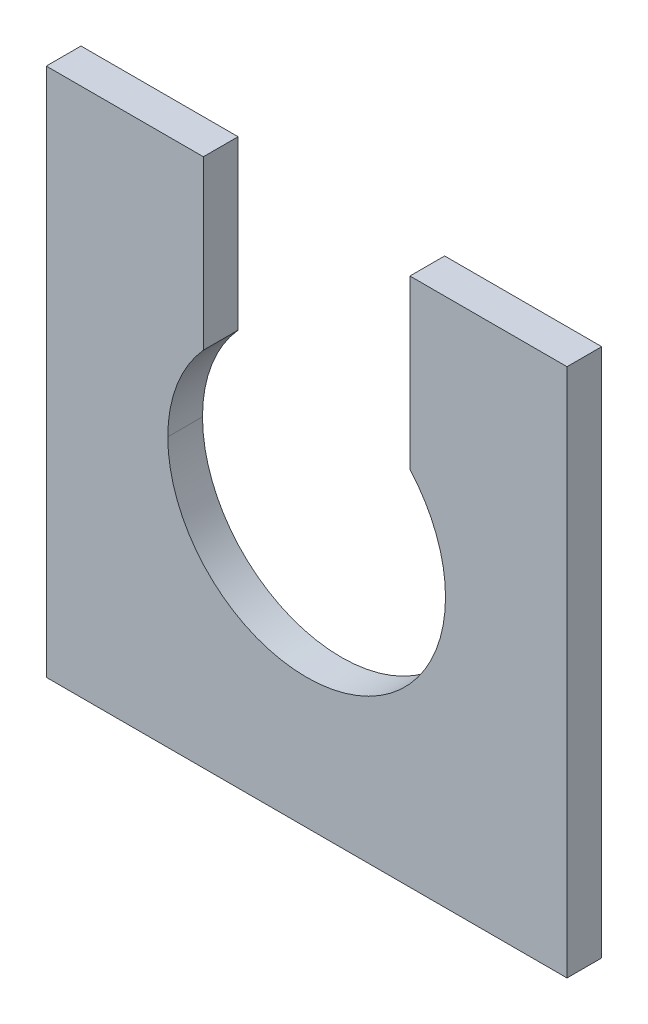
ISO-10303-21;
HEADER;
FILE_DESCRIPTION(('STEP AP214'),'2;1');
FILE_NAME('part.step','',(''),(''),'','','');
FILE_SCHEMA(('AUTOMOTIVE_DESIGN { 1 0 10303 214 1 1 1 1 }'));
ENDSEC;
DATA;
#1=APPLICATION_CONTEXT('core data for automotive mechanical design processes');
#2=APPLICATION_PROTOCOL_DEFINITION('international standard','automotive_design',2000,#1);
#3=PRODUCT_CONTEXT('',#1,'mechanical');
#4=PRODUCT('Part','Part','',(#3));
#5=PRODUCT_RELATED_PRODUCT_CATEGORY('part','',(#4));
#6=PRODUCT_DEFINITION_FORMATION('','',#4);
#7=PRODUCT_DEFINITION_CONTEXT('part definition',#1,'design');
#8=PRODUCT_DEFINITION('design','',#6,#7);
#9=PRODUCT_DEFINITION_SHAPE('','',#8);
#10=(LENGTH_UNIT() NAMED_UNIT(*) SI_UNIT(.MILLI.,.METRE.));
#11=(NAMED_UNIT(*) PLANE_ANGLE_UNIT() SI_UNIT($,.RADIAN.));
#12=(NAMED_UNIT(*) SI_UNIT($,.STERADIAN.) SOLID_ANGLE_UNIT());
#13=UNCERTAINTY_MEASURE_WITH_UNIT(LENGTH_MEASURE(1.E-05),#10,'distance_accuracy_value','');
#14=(GEOMETRIC_REPRESENTATION_CONTEXT(3) GLOBAL_UNCERTAINTY_ASSIGNED_CONTEXT((#13)) GLOBAL_UNIT_ASSIGNED_CONTEXT((#10,
#11,#12)) REPRESENTATION_CONTEXT('',''));
#15=CARTESIAN_POINT('',(0.,0.,0.));
#16=DIRECTION('',(0.,0.,1.));
#17=DIRECTION('',(1.,0.,0.));
#18=AXIS2_PLACEMENT_3D('',#15,#16,#17);
#19=CARTESIAN_POINT('',(0.,0.,0.));
#20=DIRECTION('',(0.,0.,1.));
#21=DIRECTION('',(1.,0.,0.));
#22=AXIS2_PLACEMENT_3D('',#19,#20,#21);
#23=CYLINDRICAL_SURFACE('',#22,0.8);
#24=CARTESIAN_POINT('',(0.,0.,0.));
#25=DIRECTION('',(0.,0.,1.));
#26=DIRECTION('',(1.,0.,0.));
#27=AXIS2_PLACEMENT_3D('',#24,#25,#26);
#28=CIRCLE('',#27,0.8);
#29=CARTESIAN_POINT('',(-0.8,0.,0.));
#30=VERTEX_POINT('',#29);
#31=CARTESIAN_POINT('',(0.8,0.,0.));
#32=VERTEX_POINT('',#31);
#33=EDGE_CURVE('E11',#30,#32,#28,.T.);
#34=ORIENTED_EDGE('',*,*,#33,.F.);
#35=DIRECTION('',(0.,0.,1.));
#36=VECTOR('',#35,1.);
#37=CARTESIAN_POINT('',(-0.8,0.,0.));
#38=LINE('',#37,#36);
#39=CARTESIAN_POINT('',(-0.8,0.,0.2));
#40=VERTEX_POINT('',#39);
#41=EDGE_CURVE('E23',#30,#40,#38,.T.);
#42=ORIENTED_EDGE('',*,*,#41,.T.);
#43=CARTESIAN_POINT('',(0.,0.,0.2));
#44=DIRECTION('',(0.,0.,1.));
#45=DIRECTION('',(1.,0.,0.));
#46=AXIS2_PLACEMENT_3D('',#43,#44,#45);
#47=CIRCLE('',#46,0.8);
#48=CARTESIAN_POINT('',(0.8,0.,0.2));
#49=VERTEX_POINT('',#48);
#50=EDGE_CURVE('E174',#40,#49,#47,.T.);
#51=ORIENTED_EDGE('',*,*,#50,.T.);
#52=DIRECTION('',(0.,0.,1.));
#53=VECTOR('',#52,1.);
#54=CARTESIAN_POINT('',(0.8,0.,0.));
#55=LINE('',#54,#53);
#56=EDGE_CURVE('E36',#32,#49,#55,.T.);
#57=ORIENTED_EDGE('',*,*,#56,.F.);
#58=EDGE_LOOP('',(#34,#42,#51,#57));
#59=FACE_BOUND('',#58,.T.);
#60=ADVANCED_FACE('F16',(#59),#23,.F.);
#61=CARTESIAN_POINT('',(0.,0.,0.));
#62=DIRECTION('',(0.,0.,1.));
#63=DIRECTION('',(1.,0.,0.));
#64=AXIS2_PLACEMENT_3D('',#61,#62,#63);
#65=CYLINDRICAL_SURFACE('',#64,0.8);
#66=CARTESIAN_POINT('',(0.,0.,0.));
#67=DIRECTION('',(0.,0.,1.));
#68=DIRECTION('',(1.,0.,0.));
#69=AXIS2_PLACEMENT_3D('',#66,#67,#68);
#70=CIRCLE('',#69,0.8);
#71=CARTESIAN_POINT('',(0.595,0.534766304099277,0.));
#72=VERTEX_POINT('',#71);
#73=EDGE_CURVE('E170',#32,#72,#70,.T.);
#74=ORIENTED_EDGE('',*,*,#73,.F.);
#75=ORIENTED_EDGE('',*,*,#56,.T.);
#76=CARTESIAN_POINT('',(0.,0.,0.2));
#77=DIRECTION('',(0.,0.,1.));
#78=DIRECTION('',(1.,0.,0.));
#79=AXIS2_PLACEMENT_3D('',#76,#77,#78);
#80=CIRCLE('',#79,0.8);
#81=CARTESIAN_POINT('',(0.595,0.534766304099277,0.2));
#82=VERTEX_POINT('',#81);
#83=EDGE_CURVE('E167',#49,#82,#80,.T.);
#84=ORIENTED_EDGE('',*,*,#83,.T.);
#85=DIRECTION('',(0.,0.,-1.));
#86=VECTOR('',#85,1.);
#87=CARTESIAN_POINT('',(0.595,0.534766304099277,0.));
#88=LINE('',#87,#86);
#89=EDGE_CURVE('E165',#82,#72,#88,.T.);
#90=ORIENTED_EDGE('',*,*,#89,.T.);
#91=EDGE_LOOP('',(#74,#75,#84,#90));
#92=FACE_BOUND('',#91,.T.);
#93=ADVANCED_FACE('F183',(#92),#65,.F.);
#94=CARTESIAN_POINT('',(0.,0.,0.));
#95=DIRECTION('',(0.,0.,1.));
#96=DIRECTION('',(1.,0.,0.));
#97=AXIS2_PLACEMENT_3D('',#94,#95,#96);
#98=CYLINDRICAL_SURFACE('',#97,0.8);
#99=ORIENTED_EDGE('',*,*,#41,.F.);
#100=CARTESIAN_POINT('',(0.,0.,0.));
#101=DIRECTION('',(0.,0.,1.));
#102=DIRECTION('',(1.,0.,0.));
#103=AXIS2_PLACEMENT_3D('',#100,#101,#102);
#104=CIRCLE('',#103,0.8);
#105=CARTESIAN_POINT('',(-0.595,0.534766304099277,0.));
#106=VERTEX_POINT('',#105);
#107=EDGE_CURVE('E162',#106,#30,#104,.T.);
#108=ORIENTED_EDGE('',*,*,#107,.F.);
#109=DIRECTION('',(0.,0.,1.));
#110=VECTOR('',#109,1.);
#111=CARTESIAN_POINT('',(-0.595,0.534766304099277,0.));
#112=LINE('',#111,#110);
#113=CARTESIAN_POINT('',(-0.595,0.534766304099277,0.2));
#114=VERTEX_POINT('',#113);
#115=EDGE_CURVE('E159',#106,#114,#112,.T.);
#116=ORIENTED_EDGE('',*,*,#115,.T.);
#117=CARTESIAN_POINT('',(0.,0.,0.2));
#118=DIRECTION('',(0.,0.,1.));
#119=DIRECTION('',(1.,0.,0.));
#120=AXIS2_PLACEMENT_3D('',#117,#118,#119);
#121=CIRCLE('',#120,0.8);
#122=EDGE_CURVE('E157',#114,#40,#121,.T.);
#123=ORIENTED_EDGE('',*,*,#122,.T.);
#124=EDGE_LOOP('',(#99,#108,#116,#123));
#125=FACE_BOUND('',#124,.T.);
#126=ADVANCED_FACE('F176',(#125),#98,.F.);
#127=CARTESIAN_POINT('',(-0.595000000000001,-0.5,0.65));
#128=DIRECTION('',(-1.,0.,0.));
#129=DIRECTION('',(0.,-1.,0.));
#130=AXIS2_PLACEMENT_3D('',#127,#128,#129);
#131=PLANE('',#130);
#132=DIRECTION('',(0.,0.,1.));
#133=VECTOR('',#132,1.);
#134=CARTESIAN_POINT('',(-0.595,1.5,0.65));
#135=LINE('',#134,#133);
#136=CARTESIAN_POINT('',(-0.595,1.5,0.));
#137=VERTEX_POINT('',#136);
#138=CARTESIAN_POINT('',(-0.595,1.5,0.2));
#139=VERTEX_POINT('',#138);
#140=EDGE_CURVE('E109',#137,#139,#135,.T.);
#141=ORIENTED_EDGE('',*,*,#140,.T.);
#142=DIRECTION('',(0.,1.,0.));
#143=VECTOR('',#142,1.);
#144=CARTESIAN_POINT('',(-0.595000000000001,-0.5,0.2));
#145=LINE('',#144,#143);
#146=EDGE_CURVE('E153',#114,#139,#145,.T.);
#147=ORIENTED_EDGE('',*,*,#146,.F.);
#148=ORIENTED_EDGE('',*,*,#115,.F.);
#149=DIRECTION('',(0.,1.,0.));
#150=VECTOR('',#149,1.);
#151=CARTESIAN_POINT('',(-0.595000000000001,-0.5,0.));
#152=LINE('',#151,#150);
#153=EDGE_CURVE('E151',#106,#137,#152,.T.);
#154=ORIENTED_EDGE('',*,*,#153,.T.);
#155=EDGE_LOOP('',(#141,#147,#148,#154));
#156=FACE_BOUND('',#155,.T.);
#157=ADVANCED_FACE('F213',(#156),#131,.F.);
#158=CARTESIAN_POINT('',(0.595,-0.5,0.65));
#159=DIRECTION('',(1.,0.,0.));
#160=DIRECTION('',(0.,1.,0.));
#161=AXIS2_PLACEMENT_3D('',#158,#159,#160);
#162=PLANE('',#161);
#163=DIRECTION('',(0.,0.,-1.));
#164=VECTOR('',#163,1.);
#165=CARTESIAN_POINT('',(0.595,1.5,0.65));
#166=LINE('',#165,#164);
#167=CARTESIAN_POINT('',(0.595,1.5,0.2));
#168=VERTEX_POINT('',#167);
#169=CARTESIAN_POINT('',(0.595,1.5,0.));
#170=VERTEX_POINT('',#169);
#171=EDGE_CURVE('E149',#168,#170,#166,.T.);
#172=ORIENTED_EDGE('',*,*,#171,.T.);
#173=DIRECTION('',(0.,-1.,0.));
#174=VECTOR('',#173,1.);
#175=CARTESIAN_POINT('',(0.595,-0.5,0.));
#176=LINE('',#175,#174);
#177=EDGE_CURVE('E146',#170,#72,#176,.T.);
#178=ORIENTED_EDGE('',*,*,#177,.T.);
#179=ORIENTED_EDGE('',*,*,#89,.F.);
#180=DIRECTION('',(0.,-1.,0.));
#181=VECTOR('',#180,1.);
#182=CARTESIAN_POINT('',(0.595,-0.5,0.2));
#183=LINE('',#182,#181);
#184=EDGE_CURVE('E143',#168,#82,#183,.T.);
#185=ORIENTED_EDGE('',*,*,#184,.F.);
#186=EDGE_LOOP('',(#172,#178,#179,#185));
#187=FACE_BOUND('',#186,.T.);
#188=ADVANCED_FACE('F186',(#187),#162,.F.);
#189=CARTESIAN_POINT('',(0.,0.,0.2));
#190=DIRECTION('',(0.,0.,1.));
#191=DIRECTION('',(1.,0.,0.));
#192=AXIS2_PLACEMENT_3D('',#189,#190,#191);
#193=PLANE('',#192);
#194=DIRECTION('',(-1.,0.,0.));
#195=VECTOR('',#194,1.);
#196=CARTESIAN_POINT('',(1.5,1.5,0.2));
#197=LINE('',#196,#195);
#198=CARTESIAN_POINT('',(1.5,1.5,0.2));
#199=VERTEX_POINT('',#198);
#200=EDGE_CURVE('E140',#199,#168,#197,.T.);
#201=ORIENTED_EDGE('',*,*,#200,.T.);
#202=ORIENTED_EDGE('',*,*,#184,.T.);
#203=ORIENTED_EDGE('',*,*,#83,.F.);
#204=ORIENTED_EDGE('',*,*,#50,.F.);
#205=ORIENTED_EDGE('',*,*,#122,.F.);
#206=ORIENTED_EDGE('',*,*,#146,.T.);
#207=DIRECTION('',(-1.,0.,0.));
#208=VECTOR('',#207,1.);
#209=CARTESIAN_POINT('',(1.5,1.5,0.2));
#210=LINE('',#209,#208);
#211=CARTESIAN_POINT('',(-1.5,1.5,0.2));
#212=VERTEX_POINT('',#211);
#213=EDGE_CURVE('E138',#139,#212,#210,.T.);
#214=ORIENTED_EDGE('',*,*,#213,.T.);
#215=DIRECTION('',(0.,-1.,0.));
#216=VECTOR('',#215,1.);
#217=CARTESIAN_POINT('',(-1.5,1.5,0.2));
#218=LINE('',#217,#216);
#219=CARTESIAN_POINT('',(-1.5,-1.55,0.2));
#220=VERTEX_POINT('',#219);
#221=EDGE_CURVE('E115',#212,#220,#218,.T.);
#222=ORIENTED_EDGE('',*,*,#221,.T.);
#223=DIRECTION('',(1.,0.,0.));
#224=VECTOR('',#223,1.);
#225=CARTESIAN_POINT('',(-1.5,-1.55,0.2));
#226=LINE('',#225,#224);
#227=CARTESIAN_POINT('',(1.5,-1.55,0.2));
#228=VERTEX_POINT('',#227);
#229=EDGE_CURVE('E135',#220,#228,#226,.T.);
#230=ORIENTED_EDGE('',*,*,#229,.T.);
#231=DIRECTION('',(0.,1.,0.));
#232=VECTOR('',#231,1.);
#233=CARTESIAN_POINT('',(1.5,-1.55,0.2));
#234=LINE('',#233,#232);
#235=EDGE_CURVE('E132',#228,#199,#234,.T.);
#236=ORIENTED_EDGE('',*,*,#235,.T.);
#237=EDGE_LOOP('',(#201,#202,#203,#204,#205,#206,#214,#222,#230,#236));
#238=FACE_BOUND('',#237,.T.);
#239=ADVANCED_FACE('F179',(#238),#193,.T.);
#240=CARTESIAN_POINT('',(0.,0.,0.));
#241=DIRECTION('',(0.,0.,1.));
#242=DIRECTION('',(1.,0.,0.));
#243=AXIS2_PLACEMENT_3D('',#240,#241,#242);
#244=PLANE('',#243);
#245=ORIENTED_EDGE('',*,*,#153,.F.);
#246=ORIENTED_EDGE('',*,*,#107,.T.);
#247=ORIENTED_EDGE('',*,*,#33,.T.);
#248=ORIENTED_EDGE('',*,*,#73,.T.);
#249=ORIENTED_EDGE('',*,*,#177,.F.);
#250=DIRECTION('',(-1.,0.,0.));
#251=VECTOR('',#250,1.);
#252=CARTESIAN_POINT('',(1.5,1.5,0.));
#253=LINE('',#252,#251);
#254=CARTESIAN_POINT('',(1.5,1.5,0.));
#255=VERTEX_POINT('',#254);
#256=EDGE_CURVE('E129',#255,#170,#253,.T.);
#257=ORIENTED_EDGE('',*,*,#256,.F.);
#258=DIRECTION('',(0.,1.,0.));
#259=VECTOR('',#258,1.);
#260=CARTESIAN_POINT('',(1.5,-1.55,0.));
#261=LINE('',#260,#259);
#262=CARTESIAN_POINT('',(1.5,-1.55,0.));
#263=VERTEX_POINT('',#262);
#264=EDGE_CURVE('E126',#263,#255,#261,.T.);
#265=ORIENTED_EDGE('',*,*,#264,.F.);
#266=DIRECTION('',(1.,0.,0.));
#267=VECTOR('',#266,1.);
#268=CARTESIAN_POINT('',(-1.5,-1.55,0.));
#269=LINE('',#268,#267);
#270=CARTESIAN_POINT('',(-1.5,-1.55,0.));
#271=VERTEX_POINT('',#270);
#272=EDGE_CURVE('E98',#271,#263,#269,.T.);
#273=ORIENTED_EDGE('',*,*,#272,.F.);
#274=DIRECTION('',(0.,-1.,0.));
#275=VECTOR('',#274,1.);
#276=CARTESIAN_POINT('',(-1.5,1.5,0.));
#277=LINE('',#276,#275);
#278=CARTESIAN_POINT('',(-1.5,1.5,0.));
#279=VERTEX_POINT('',#278);
#280=EDGE_CURVE('E92',#279,#271,#277,.T.);
#281=ORIENTED_EDGE('',*,*,#280,.F.);
#282=DIRECTION('',(-1.,0.,0.));
#283=VECTOR('',#282,1.);
#284=CARTESIAN_POINT('',(1.5,1.5,0.));
#285=LINE('',#284,#283);
#286=EDGE_CURVE('E96',#137,#279,#285,.T.);
#287=ORIENTED_EDGE('',*,*,#286,.F.);
#288=EDGE_LOOP('',(#245,#246,#247,#248,#249,#257,#265,#273,#281,#287));
#289=FACE_BOUND('',#288,.T.);
#290=ADVANCED_FACE('F95',(#289),#244,.F.);
#291=CARTESIAN_POINT('',(1.5,1.5,0.2));
#292=DIRECTION('',(0.,-1.,0.));
#293=DIRECTION('',(0.,0.,-1.));
#294=AXIS2_PLACEMENT_3D('',#291,#292,#293);
#295=PLANE('',#294);
#296=ORIENTED_EDGE('',*,*,#171,.F.);
#297=ORIENTED_EDGE('',*,*,#200,.F.);
#298=DIRECTION('',(0.,0.,-1.));
#299=VECTOR('',#298,1.);
#300=CARTESIAN_POINT('',(1.5,1.5,0.2));
#301=LINE('',#300,#299);
#302=EDGE_CURVE('E111',#199,#255,#301,.T.);
#303=ORIENTED_EDGE('',*,*,#302,.T.);
#304=ORIENTED_EDGE('',*,*,#256,.T.);
#305=EDGE_LOOP('',(#296,#297,#303,#304));
#306=FACE_BOUND('',#305,.T.);
#307=ADVANCED_FACE('F188',(#306),#295,.F.);
#308=CARTESIAN_POINT('',(1.5,-1.55,0.2));
#309=DIRECTION('',(-1.,0.,0.));
#310=DIRECTION('',(0.,-1.,0.));
#311=AXIS2_PLACEMENT_3D('',#308,#309,#310);
#312=PLANE('',#311);
#313=ORIENTED_EDGE('',*,*,#264,.T.);
#314=ORIENTED_EDGE('',*,*,#302,.F.);
#315=ORIENTED_EDGE('',*,*,#235,.F.);
#316=DIRECTION('',(0.,0.,-1.));
#317=VECTOR('',#316,1.);
#318=CARTESIAN_POINT('',(1.5,-1.55,0.2));
#319=LINE('',#318,#317);
#320=EDGE_CURVE('E118',#228,#263,#319,.T.);
#321=ORIENTED_EDGE('',*,*,#320,.T.);
#322=EDGE_LOOP('',(#313,#314,#315,#321));
#323=FACE_BOUND('',#322,.T.);
#324=ADVANCED_FACE('F191',(#323),#312,.F.);
#325=CARTESIAN_POINT('',(-1.5,-1.55,0.2));
#326=DIRECTION('',(0.,1.,0.));
#327=DIRECTION('',(0.,0.,1.));
#328=AXIS2_PLACEMENT_3D('',#325,#326,#327);
#329=PLANE('',#328);
#330=ORIENTED_EDGE('',*,*,#272,.T.);
#331=ORIENTED_EDGE('',*,*,#320,.F.);
#332=ORIENTED_EDGE('',*,*,#229,.F.);
#333=DIRECTION('',(0.,0.,-1.));
#334=VECTOR('',#333,1.);
#335=CARTESIAN_POINT('',(-1.5,-1.55,0.2));
#336=LINE('',#335,#334);
#337=EDGE_CURVE('E116',#220,#271,#336,.T.);
#338=ORIENTED_EDGE('',*,*,#337,.T.);
#339=EDGE_LOOP('',(#330,#331,#332,#338));
#340=FACE_BOUND('',#339,.T.);
#341=ADVANCED_FACE('F196',(#340),#329,.F.);
#342=CARTESIAN_POINT('',(-1.5,1.5,0.2));
#343=DIRECTION('',(1.,0.,0.));
#344=DIRECTION('',(0.,1.,0.));
#345=AXIS2_PLACEMENT_3D('',#342,#343,#344);
#346=PLANE('',#345);
#347=ORIENTED_EDGE('',*,*,#280,.T.);
#348=ORIENTED_EDGE('',*,*,#337,.F.);
#349=ORIENTED_EDGE('',*,*,#221,.F.);
#350=DIRECTION('',(0.,0.,-1.));
#351=VECTOR('',#350,1.);
#352=CARTESIAN_POINT('',(-1.5,1.5,0.2));
#353=LINE('',#352,#351);
#354=EDGE_CURVE('E108',#212,#279,#353,.T.);
#355=ORIENTED_EDGE('',*,*,#354,.T.);
#356=EDGE_LOOP('',(#347,#348,#349,#355));
#357=FACE_BOUND('',#356,.T.);
#358=ADVANCED_FACE('F114',(#357),#346,.F.);
#359=CARTESIAN_POINT('',(1.5,1.5,0.2));
#360=DIRECTION('',(0.,-1.,0.));
#361=DIRECTION('',(0.,0.,-1.));
#362=AXIS2_PLACEMENT_3D('',#359,#360,#361);
#363=PLANE('',#362);
#364=ORIENTED_EDGE('',*,*,#140,.F.);
#365=ORIENTED_EDGE('',*,*,#286,.T.);
#366=ORIENTED_EDGE('',*,*,#354,.F.);
#367=ORIENTED_EDGE('',*,*,#213,.F.);
#368=EDGE_LOOP('',(#364,#365,#366,#367));
#369=FACE_BOUND('',#368,.T.);
#370=ADVANCED_FACE('F106',(#369),#363,.F.);
#371=CLOSED_SHELL('',(#60,#93,#126,#157,#188,#239,#290,#307,#324,#341,#358,#370));
#372=MANIFOLD_SOLID_BREP('B1',#371);
#373=ADVANCED_BREP_SHAPE_REPRESENTATION('',(#18,#372),#14);
#374=SHAPE_DEFINITION_REPRESENTATION(#9,#373);
ENDSEC;
END-ISO-10303-21;
